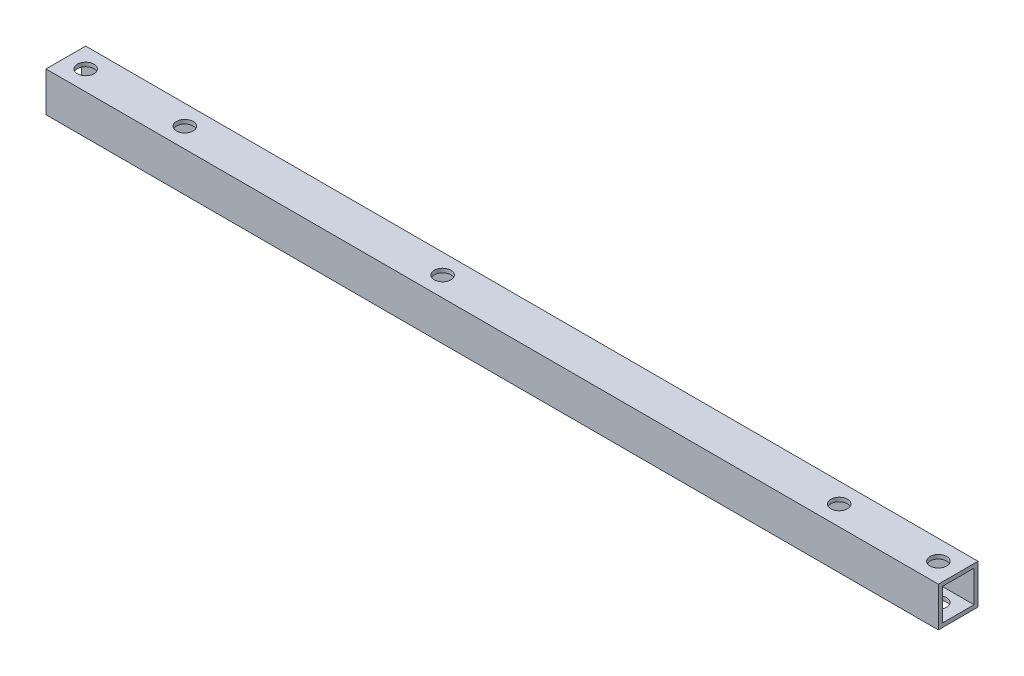
ISO-10303-21;
HEADER;
FILE_DESCRIPTION(('STEP AP214'),'2;1');
FILE_NAME('part.step','',(''),(''),'','','');
FILE_SCHEMA(('AUTOMOTIVE_DESIGN { 1 0 10303 214 1 1 1 1 }'));
ENDSEC;
DATA;
#1=APPLICATION_CONTEXT('core data for automotive mechanical design processes');
#2=APPLICATION_PROTOCOL_DEFINITION('international standard','automotive_design',2000,#1);
#3=PRODUCT_CONTEXT('',#1,'mechanical');
#4=PRODUCT('Part','Part','',(#3));
#5=PRODUCT_RELATED_PRODUCT_CATEGORY('part','',(#4));
#6=PRODUCT_DEFINITION_FORMATION('','',#4);
#7=PRODUCT_DEFINITION_CONTEXT('part definition',#1,'design');
#8=PRODUCT_DEFINITION('design','',#6,#7);
#9=PRODUCT_DEFINITION_SHAPE('','',#8);
#10=(LENGTH_UNIT() NAMED_UNIT(*) SI_UNIT(.MILLI.,.METRE.));
#11=(NAMED_UNIT(*) PLANE_ANGLE_UNIT() SI_UNIT($,.RADIAN.));
#12=(NAMED_UNIT(*) SI_UNIT($,.STERADIAN.) SOLID_ANGLE_UNIT());
#13=UNCERTAINTY_MEASURE_WITH_UNIT(LENGTH_MEASURE(1.E-05),#10,'distance_accuracy_value','');
#14=(GEOMETRIC_REPRESENTATION_CONTEXT(3) GLOBAL_UNCERTAINTY_ASSIGNED_CONTEXT((#13)) GLOBAL_UNIT_ASSIGNED_CONTEXT((#10,
#11,#12)) REPRESENTATION_CONTEXT('',''));
#15=CARTESIAN_POINT('',(0.,0.,0.));
#16=DIRECTION('',(0.,0.,1.));
#17=DIRECTION('',(1.,0.,0.));
#18=AXIS2_PLACEMENT_3D('',#15,#16,#17);
#19=CARTESIAN_POINT('',(225.,0.,0.));
#20=DIRECTION('',(1.,0.,0.));
#21=DIRECTION('',(0.,0.,-1.));
#22=AXIS2_PLACEMENT_3D('',#19,#20,#21);
#23=PLANE('',#22);
#24=DIRECTION('',(0.,1.,0.));
#25=VECTOR('',#24,1.);
#26=CARTESIAN_POINT('',(225.,5.,-5.));
#27=LINE('',#26,#25);
#28=CARTESIAN_POINT('',(225.,-5.,-5.));
#29=VERTEX_POINT('',#28);
#30=CARTESIAN_POINT('',(225.,5.,-5.));
#31=VERTEX_POINT('',#30);
#32=EDGE_CURVE('E164',#29,#31,#27,.T.);
#33=ORIENTED_EDGE('',*,*,#32,.T.);
#34=DIRECTION('',(0.,0.,1.));
#35=VECTOR('',#34,1.);
#36=CARTESIAN_POINT('',(225.,5.,5.));
#37=LINE('',#36,#35);
#38=CARTESIAN_POINT('',(225.,5.,5.));
#39=VERTEX_POINT('',#38);
#40=EDGE_CURVE('E167',#31,#39,#37,.T.);
#41=ORIENTED_EDGE('',*,*,#40,.T.);
#42=DIRECTION('',(0.,-1.,0.));
#43=VECTOR('',#42,1.);
#44=CARTESIAN_POINT('',(225.,5.,5.));
#45=LINE('',#44,#43);
#46=CARTESIAN_POINT('',(225.,-5.,5.));
#47=VERTEX_POINT('',#46);
#48=EDGE_CURVE('E170',#39,#47,#45,.T.);
#49=ORIENTED_EDGE('',*,*,#48,.T.);
#50=DIRECTION('',(0.,0.,-1.));
#51=VECTOR('',#50,1.);
#52=CARTESIAN_POINT('',(225.,-5.,5.));
#53=LINE('',#52,#51);
#54=EDGE_CURVE('E172',#47,#29,#53,.T.);
#55=ORIENTED_EDGE('',*,*,#54,.T.);
#56=EDGE_LOOP('',(#33,#41,#49,#55));
#57=FACE_BOUND('',#56,.T.);
#58=DIRECTION('',(0.,0.,1.));
#59=VECTOR('',#58,1.);
#60=CARTESIAN_POINT('',(225.,4.,5.));
#61=LINE('',#60,#59);
#62=CARTESIAN_POINT('',(225.,4.,-4.));
#63=VERTEX_POINT('',#62);
#64=CARTESIAN_POINT('',(225.,4.,4.));
#65=VERTEX_POINT('',#64);
#66=EDGE_CURVE('E134',#63,#65,#61,.T.);
#67=ORIENTED_EDGE('',*,*,#66,.F.);
#68=DIRECTION('',(0.,1.,0.));
#69=VECTOR('',#68,1.);
#70=CARTESIAN_POINT('',(225.,5.,-4.));
#71=LINE('',#70,#69);
#72=CARTESIAN_POINT('',(225.,-4.,-4.));
#73=VERTEX_POINT('',#72);
#74=EDGE_CURVE('E126',#73,#63,#71,.T.);
#75=ORIENTED_EDGE('',*,*,#74,.F.);
#76=DIRECTION('',(0.,0.,-1.));
#77=VECTOR('',#76,1.);
#78=CARTESIAN_POINT('',(225.,-4.,5.));
#79=LINE('',#78,#77);
#80=CARTESIAN_POINT('',(225.,-4.,4.));
#81=VERTEX_POINT('',#80);
#82=EDGE_CURVE('E148',#81,#73,#79,.T.);
#83=ORIENTED_EDGE('',*,*,#82,.F.);
#84=DIRECTION('',(0.,-1.,0.));
#85=VECTOR('',#84,1.);
#86=CARTESIAN_POINT('',(225.,5.,4.));
#87=LINE('',#86,#85);
#88=EDGE_CURVE('E146',#65,#81,#87,.T.);
#89=ORIENTED_EDGE('',*,*,#88,.F.);
#90=EDGE_LOOP('',(#67,#75,#83,#89));
#91=FACE_BOUND('',#90,.T.);
#92=ADVANCED_FACE('F59',(#57,#91),#23,.T.);
#93=CARTESIAN_POINT('',(0.,0.,0.));
#94=DIRECTION('',(1.,0.,0.));
#95=DIRECTION('',(0.,0.,-1.));
#96=AXIS2_PLACEMENT_3D('',#93,#94,#95);
#97=PLANE('',#96);
#98=DIRECTION('',(0.,1.,0.));
#99=VECTOR('',#98,1.);
#100=CARTESIAN_POINT('',(0.,5.,-5.));
#101=LINE('',#100,#99);
#102=CARTESIAN_POINT('',(0.,-5.,-5.));
#103=VERTEX_POINT('',#102);
#104=CARTESIAN_POINT('',(0.,5.,-5.));
#105=VERTEX_POINT('',#104);
#106=EDGE_CURVE('E142',#103,#105,#101,.T.);
#107=ORIENTED_EDGE('',*,*,#106,.F.);
#108=DIRECTION('',(0.,0.,-1.));
#109=VECTOR('',#108,1.);
#110=CARTESIAN_POINT('',(0.,-5.,5.));
#111=LINE('',#110,#109);
#112=CARTESIAN_POINT('',(0.,-5.,5.));
#113=VERTEX_POINT('',#112);
#114=EDGE_CURVE('E168',#113,#103,#111,.T.);
#115=ORIENTED_EDGE('',*,*,#114,.F.);
#116=DIRECTION('',(0.,-1.,0.));
#117=VECTOR('',#116,1.);
#118=CARTESIAN_POINT('',(0.,5.,5.));
#119=LINE('',#118,#117);
#120=CARTESIAN_POINT('',(0.,5.,5.));
#121=VERTEX_POINT('',#120);
#122=EDGE_CURVE('E179',#121,#113,#119,.T.);
#123=ORIENTED_EDGE('',*,*,#122,.F.);
#124=DIRECTION('',(0.,0.,1.));
#125=VECTOR('',#124,1.);
#126=CARTESIAN_POINT('',(0.,5.,5.));
#127=LINE('',#126,#125);
#128=EDGE_CURVE('E177',#105,#121,#127,.T.);
#129=ORIENTED_EDGE('',*,*,#128,.F.);
#130=EDGE_LOOP('',(#107,#115,#123,#129));
#131=FACE_BOUND('',#130,.T.);
#132=DIRECTION('',(0.,1.,0.));
#133=VECTOR('',#132,1.);
#134=CARTESIAN_POINT('',(0.,5.,-4.));
#135=LINE('',#134,#133);
#136=CARTESIAN_POINT('',(0.,-4.,-4.));
#137=VERTEX_POINT('',#136);
#138=CARTESIAN_POINT('',(0.,4.,-4.));
#139=VERTEX_POINT('',#138);
#140=EDGE_CURVE('E84',#137,#139,#135,.T.);
#141=ORIENTED_EDGE('',*,*,#140,.T.);
#142=DIRECTION('',(0.,0.,1.));
#143=VECTOR('',#142,1.);
#144=CARTESIAN_POINT('',(0.,4.,5.));
#145=LINE('',#144,#143);
#146=CARTESIAN_POINT('',(0.,4.,4.));
#147=VERTEX_POINT('',#146);
#148=EDGE_CURVE('E141',#139,#147,#145,.T.);
#149=ORIENTED_EDGE('',*,*,#148,.T.);
#150=DIRECTION('',(0.,-1.,0.));
#151=VECTOR('',#150,1.);
#152=CARTESIAN_POINT('',(0.,5.,4.));
#153=LINE('',#152,#151);
#154=CARTESIAN_POINT('',(0.,-4.,4.));
#155=VERTEX_POINT('',#154);
#156=EDGE_CURVE('E156',#147,#155,#153,.T.);
#157=ORIENTED_EDGE('',*,*,#156,.T.);
#158=DIRECTION('',(0.,0.,-1.));
#159=VECTOR('',#158,1.);
#160=CARTESIAN_POINT('',(0.,-4.,5.));
#161=LINE('',#160,#159);
#162=EDGE_CURVE('E135',#155,#137,#161,.T.);
#163=ORIENTED_EDGE('',*,*,#162,.T.);
#164=EDGE_LOOP('',(#141,#149,#157,#163));
#165=FACE_BOUND('',#164,.T.);
#166=ADVANCED_FACE('F268',(#131,#165),#97,.F.);
#167=CARTESIAN_POINT('',(225.,5.,-5.));
#168=DIRECTION('',(0.,0.,1.));
#169=DIRECTION('',(0.,-1.,0.));
#170=AXIS2_PLACEMENT_3D('',#167,#168,#169);
#171=PLANE('',#170);
#172=ORIENTED_EDGE('',*,*,#106,.T.);
#173=DIRECTION('',(-1.,0.,0.));
#174=VECTOR('',#173,1.);
#175=CARTESIAN_POINT('',(225.,5.,-5.));
#176=LINE('',#175,#174);
#177=EDGE_CURVE('E12',#31,#105,#176,.T.);
#178=ORIENTED_EDGE('',*,*,#177,.F.);
#179=ORIENTED_EDGE('',*,*,#32,.F.);
#180=DIRECTION('',(-1.,0.,0.));
#181=VECTOR('',#180,1.);
#182=CARTESIAN_POINT('',(225.,-5.,-5.));
#183=LINE('',#182,#181);
#184=EDGE_CURVE('E174',#29,#103,#183,.T.);
#185=ORIENTED_EDGE('',*,*,#184,.T.);
#186=EDGE_LOOP('',(#172,#178,#179,#185));
#187=FACE_BOUND('',#186,.T.);
#188=ADVANCED_FACE('F61',(#187),#171,.F.);
#189=CARTESIAN_POINT('',(225.,5.,5.));
#190=DIRECTION('',(0.,-1.,0.));
#191=DIRECTION('',(0.,0.,-1.));
#192=AXIS2_PLACEMENT_3D('',#189,#190,#191);
#193=PLANE('',#192);
#194=CARTESIAN_POINT('',(95.,5.,0.));
#195=DIRECTION('',(0.,1.,0.));
#196=DIRECTION('',(0.,0.,1.));
#197=AXIS2_PLACEMENT_3D('',#194,#195,#196);
#198=CIRCLE('',#197,2.1);
#199=CARTESIAN_POINT('',(95.,5.,2.1));
#200=VERTEX_POINT('',#199);
#201=EDGE_CURVE('E241',#200,#200,#198,.T.);
#202=ORIENTED_EDGE('',*,*,#201,.F.);
#203=EDGE_LOOP('',(#202));
#204=FACE_BOUND('',#203,.T.);
#205=CARTESIAN_POINT('',(220.,5.,0.));
#206=DIRECTION('',(0.,1.,0.));
#207=DIRECTION('',(0.,0.,1.));
#208=AXIS2_PLACEMENT_3D('',#205,#206,#207);
#209=CIRCLE('',#208,2.10000000000002);
#210=CARTESIAN_POINT('',(220.,5.,2.10000000000002));
#211=VERTEX_POINT('',#210);
#212=EDGE_CURVE('E228',#211,#211,#209,.T.);
#213=ORIENTED_EDGE('',*,*,#212,.F.);
#214=EDGE_LOOP('',(#213));
#215=FACE_BOUND('',#214,.T.);
#216=CARTESIAN_POINT('',(5.,5.,0.));
#217=DIRECTION('',(0.,1.,0.));
#218=DIRECTION('',(0.,0.,-1.));
#219=AXIS2_PLACEMENT_3D('',#216,#217,#218);
#220=CIRCLE('',#219,2.10000000000002);
#221=CARTESIAN_POINT('',(5.,5.,-2.10000000000002));
#222=VERTEX_POINT('',#221);
#223=EDGE_CURVE('E221',#222,#222,#220,.T.);
#224=ORIENTED_EDGE('',*,*,#223,.F.);
#225=EDGE_LOOP('',(#224));
#226=FACE_BOUND('',#225,.T.);
#227=CARTESIAN_POINT('',(30.,5.,0.));
#228=DIRECTION('',(0.,1.,0.));
#229=DIRECTION('',(0.,0.,-1.));
#230=AXIS2_PLACEMENT_3D('',#227,#228,#229);
#231=CIRCLE('',#230,2.1);
#232=CARTESIAN_POINT('',(30.,5.,-2.10000000000001));
#233=VERTEX_POINT('',#232);
#234=EDGE_CURVE('E233',#233,#233,#231,.T.);
#235=ORIENTED_EDGE('',*,*,#234,.F.);
#236=EDGE_LOOP('',(#235));
#237=FACE_BOUND('',#236,.T.);
#238=CARTESIAN_POINT('',(195.,5.,0.));
#239=DIRECTION('',(0.,1.,0.));
#240=DIRECTION('',(0.,0.,1.));
#241=AXIS2_PLACEMENT_3D('',#238,#239,#240);
#242=CIRCLE('',#241,2.10000000000002);
#243=CARTESIAN_POINT('',(195.,5.,2.10000000000003));
#244=VERTEX_POINT('',#243);
#245=EDGE_CURVE('E215',#244,#244,#242,.T.);
#246=ORIENTED_EDGE('',*,*,#245,.F.);
#247=EDGE_LOOP('',(#246));
#248=FACE_BOUND('',#247,.T.);
#249=ORIENTED_EDGE('',*,*,#128,.T.);
#250=DIRECTION('',(-1.,0.,0.));
#251=VECTOR('',#250,1.);
#252=CARTESIAN_POINT('',(225.,5.,5.));
#253=LINE('',#252,#251);
#254=EDGE_CURVE('E68',#39,#121,#253,.T.);
#255=ORIENTED_EDGE('',*,*,#254,.F.);
#256=ORIENTED_EDGE('',*,*,#40,.F.);
#257=ORIENTED_EDGE('',*,*,#177,.T.);
#258=EDGE_LOOP('',(#249,#255,#256,#257));
#259=FACE_BOUND('',#258,.T.);
#260=ADVANCED_FACE('F292',(#204,#215,#226,#237,#248,#259),#193,.F.);
#261=CARTESIAN_POINT('',(225.,5.,5.));
#262=DIRECTION('',(0.,0.,-1.));
#263=DIRECTION('',(0.,1.,0.));
#264=AXIS2_PLACEMENT_3D('',#261,#262,#263);
#265=PLANE('',#264);
#266=ORIENTED_EDGE('',*,*,#122,.T.);
#267=DIRECTION('',(-1.,0.,0.));
#268=VECTOR('',#267,1.);
#269=CARTESIAN_POINT('',(225.,-5.,5.));
#270=LINE('',#269,#268);
#271=EDGE_CURVE('E184',#47,#113,#270,.T.);
#272=ORIENTED_EDGE('',*,*,#271,.F.);
#273=ORIENTED_EDGE('',*,*,#48,.F.);
#274=ORIENTED_EDGE('',*,*,#254,.T.);
#275=EDGE_LOOP('',(#266,#272,#273,#274));
#276=FACE_BOUND('',#275,.T.);
#277=ADVANCED_FACE('F290',(#276),#265,.F.);
#278=CARTESIAN_POINT('',(225.,-5.,5.));
#279=DIRECTION('',(0.,1.,0.));
#280=DIRECTION('',(0.,0.,1.));
#281=AXIS2_PLACEMENT_3D('',#278,#279,#280);
#282=PLANE('',#281);
#283=CARTESIAN_POINT('',(95.,-5.,0.));
#284=DIRECTION('',(0.,1.,0.));
#285=DIRECTION('',(0.,0.,1.));
#286=AXIS2_PLACEMENT_3D('',#283,#284,#285);
#287=CIRCLE('',#286,2.1);
#288=CARTESIAN_POINT('',(95.,-5.,2.1));
#289=VERTEX_POINT('',#288);
#290=EDGE_CURVE('E244',#289,#289,#287,.T.);
#291=ORIENTED_EDGE('',*,*,#290,.T.);
#292=EDGE_LOOP('',(#291));
#293=FACE_BOUND('',#292,.T.);
#294=CARTESIAN_POINT('',(220.,-5.,0.));
#295=DIRECTION('',(0.,1.,0.));
#296=DIRECTION('',(0.,0.,1.));
#297=AXIS2_PLACEMENT_3D('',#294,#295,#296);
#298=CIRCLE('',#297,2.10000000000002);
#299=CARTESIAN_POINT('',(220.,-5.,2.10000000000002));
#300=VERTEX_POINT('',#299);
#301=EDGE_CURVE('E218',#300,#300,#298,.T.);
#302=ORIENTED_EDGE('',*,*,#301,.T.);
#303=EDGE_LOOP('',(#302));
#304=FACE_BOUND('',#303,.T.);
#305=CARTESIAN_POINT('',(5.,-5.,0.));
#306=DIRECTION('',(0.,1.,0.));
#307=DIRECTION('',(0.,0.,-1.));
#308=AXIS2_PLACEMENT_3D('',#305,#306,#307);
#309=CIRCLE('',#308,2.10000000000002);
#310=CARTESIAN_POINT('',(5.,-5.,-2.10000000000002));
#311=VERTEX_POINT('',#310);
#312=EDGE_CURVE('E224',#311,#311,#309,.T.);
#313=ORIENTED_EDGE('',*,*,#312,.T.);
#314=EDGE_LOOP('',(#313));
#315=FACE_BOUND('',#314,.T.);
#316=CARTESIAN_POINT('',(30.,-5.,0.));
#317=DIRECTION('',(0.,1.,0.));
#318=DIRECTION('',(0.,0.,-1.));
#319=AXIS2_PLACEMENT_3D('',#316,#317,#318);
#320=CIRCLE('',#319,2.1);
#321=CARTESIAN_POINT('',(30.,-5.,-2.10000000000001));
#322=VERTEX_POINT('',#321);
#323=EDGE_CURVE('E225',#322,#322,#320,.T.);
#324=ORIENTED_EDGE('',*,*,#323,.T.);
#325=EDGE_LOOP('',(#324));
#326=FACE_BOUND('',#325,.T.);
#327=CARTESIAN_POINT('',(195.,-5.,0.));
#328=DIRECTION('',(0.,1.,0.));
#329=DIRECTION('',(0.,0.,1.));
#330=AXIS2_PLACEMENT_3D('',#327,#328,#329);
#331=CIRCLE('',#330,2.10000000000002);
#332=CARTESIAN_POINT('',(195.,-5.,2.10000000000003));
#333=VERTEX_POINT('',#332);
#334=EDGE_CURVE('E193',#333,#333,#331,.T.);
#335=ORIENTED_EDGE('',*,*,#334,.T.);
#336=EDGE_LOOP('',(#335));
#337=FACE_BOUND('',#336,.T.);
#338=ORIENTED_EDGE('',*,*,#114,.T.);
#339=ORIENTED_EDGE('',*,*,#184,.F.);
#340=ORIENTED_EDGE('',*,*,#54,.F.);
#341=ORIENTED_EDGE('',*,*,#271,.T.);
#342=EDGE_LOOP('',(#338,#339,#340,#341));
#343=FACE_BOUND('',#342,.T.);
#344=ADVANCED_FACE('F287',(#293,#304,#315,#326,#337,#343),#282,.F.);
#345=CARTESIAN_POINT('',(225.,5.,-4.));
#346=DIRECTION('',(0.,0.,1.));
#347=DIRECTION('',(0.,-1.,0.));
#348=AXIS2_PLACEMENT_3D('',#345,#346,#347);
#349=PLANE('',#348);
#350=ORIENTED_EDGE('',*,*,#140,.F.);
#351=DIRECTION('',(-1.,0.,0.));
#352=VECTOR('',#351,1.);
#353=CARTESIAN_POINT('',(225.,-4.,-4.));
#354=LINE('',#353,#352);
#355=EDGE_CURVE('E130',#73,#137,#354,.T.);
#356=ORIENTED_EDGE('',*,*,#355,.F.);
#357=ORIENTED_EDGE('',*,*,#74,.T.);
#358=DIRECTION('',(-1.,0.,0.));
#359=VECTOR('',#358,1.);
#360=CARTESIAN_POINT('',(225.,4.,-4.));
#361=LINE('',#360,#359);
#362=EDGE_CURVE('E129',#63,#139,#361,.T.);
#363=ORIENTED_EDGE('',*,*,#362,.T.);
#364=EDGE_LOOP('',(#350,#356,#357,#363));
#365=FACE_BOUND('',#364,.T.);
#366=ADVANCED_FACE('F128',(#365),#349,.T.);
#367=CARTESIAN_POINT('',(225.,4.,5.));
#368=DIRECTION('',(0.,-1.,0.));
#369=DIRECTION('',(0.,0.,-1.));
#370=AXIS2_PLACEMENT_3D('',#367,#368,#369);
#371=PLANE('',#370);
#372=CARTESIAN_POINT('',(95.,4.,0.));
#373=DIRECTION('',(0.,-1.,0.));
#374=DIRECTION('',(0.,0.,-1.));
#375=AXIS2_PLACEMENT_3D('',#372,#373,#374);
#376=CIRCLE('',#375,2.1);
#377=CARTESIAN_POINT('',(95.,4.,-2.1));
#378=VERTEX_POINT('',#377);
#379=EDGE_CURVE('E236',#378,#378,#376,.T.);
#380=ORIENTED_EDGE('',*,*,#379,.F.);
#381=EDGE_LOOP('',(#380));
#382=FACE_BOUND('',#381,.T.);
#383=CARTESIAN_POINT('',(220.,4.,0.));
#384=DIRECTION('',(0.,-1.,0.));
#385=DIRECTION('',(0.,0.,-1.));
#386=AXIS2_PLACEMENT_3D('',#383,#384,#385);
#387=CIRCLE('',#386,2.10000000000002);
#388=CARTESIAN_POINT('',(220.,4.,-2.10000000000002));
#389=VERTEX_POINT('',#388);
#390=EDGE_CURVE('E154',#389,#389,#387,.T.);
#391=ORIENTED_EDGE('',*,*,#390,.F.);
#392=EDGE_LOOP('',(#391));
#393=FACE_BOUND('',#392,.T.);
#394=CARTESIAN_POINT('',(5.,4.,0.));
#395=DIRECTION('',(0.,-1.,0.));
#396=DIRECTION('',(0.,0.,-1.));
#397=AXIS2_PLACEMENT_3D('',#394,#395,#396);
#398=CIRCLE('',#397,2.10000000000002);
#399=CARTESIAN_POINT('',(5.,4.,-2.10000000000002));
#400=VERTEX_POINT('',#399);
#401=EDGE_CURVE('E200',#400,#400,#398,.T.);
#402=ORIENTED_EDGE('',*,*,#401,.F.);
#403=EDGE_LOOP('',(#402));
#404=FACE_BOUND('',#403,.T.);
#405=CARTESIAN_POINT('',(30.,4.,0.));
#406=DIRECTION('',(0.,-1.,0.));
#407=DIRECTION('',(0.,0.,-1.));
#408=AXIS2_PLACEMENT_3D('',#405,#406,#407);
#409=CIRCLE('',#408,2.1);
#410=CARTESIAN_POINT('',(30.,4.,-2.10000000000001));
#411=VERTEX_POINT('',#410);
#412=EDGE_CURVE('E197',#411,#411,#409,.T.);
#413=ORIENTED_EDGE('',*,*,#412,.F.);
#414=EDGE_LOOP('',(#413));
#415=FACE_BOUND('',#414,.T.);
#416=CARTESIAN_POINT('',(195.,4.,0.));
#417=DIRECTION('',(0.,-1.,0.));
#418=DIRECTION('',(0.,0.,-1.));
#419=AXIS2_PLACEMENT_3D('',#416,#417,#418);
#420=CIRCLE('',#419,2.10000000000002);
#421=CARTESIAN_POINT('',(195.,4.,-2.10000000000001));
#422=VERTEX_POINT('',#421);
#423=EDGE_CURVE('E192',#422,#422,#420,.T.);
#424=ORIENTED_EDGE('',*,*,#423,.F.);
#425=EDGE_LOOP('',(#424));
#426=FACE_BOUND('',#425,.T.);
#427=ORIENTED_EDGE('',*,*,#148,.F.);
#428=ORIENTED_EDGE('',*,*,#362,.F.);
#429=ORIENTED_EDGE('',*,*,#66,.T.);
#430=DIRECTION('',(-1.,0.,0.));
#431=VECTOR('',#430,1.);
#432=CARTESIAN_POINT('',(225.,4.,4.));
#433=LINE('',#432,#431);
#434=EDGE_CURVE('E143',#65,#147,#433,.T.);
#435=ORIENTED_EDGE('',*,*,#434,.T.);
#436=EDGE_LOOP('',(#427,#428,#429,#435));
#437=FACE_BOUND('',#436,.T.);
#438=ADVANCED_FACE('F138',(#382,#393,#404,#415,#426,#437),#371,.T.);
#439=CARTESIAN_POINT('',(225.,5.,4.));
#440=DIRECTION('',(0.,0.,-1.));
#441=DIRECTION('',(0.,1.,0.));
#442=AXIS2_PLACEMENT_3D('',#439,#440,#441);
#443=PLANE('',#442);
#444=ORIENTED_EDGE('',*,*,#156,.F.);
#445=ORIENTED_EDGE('',*,*,#434,.F.);
#446=ORIENTED_EDGE('',*,*,#88,.T.);
#447=DIRECTION('',(-1.,0.,0.));
#448=VECTOR('',#447,1.);
#449=CARTESIAN_POINT('',(225.,-4.,4.));
#450=LINE('',#449,#448);
#451=EDGE_CURVE('E76',#81,#155,#450,.T.);
#452=ORIENTED_EDGE('',*,*,#451,.T.);
#453=EDGE_LOOP('',(#444,#445,#446,#452));
#454=FACE_BOUND('',#453,.T.);
#455=ADVANCED_FACE('F258',(#454),#443,.T.);
#456=CARTESIAN_POINT('',(225.,-4.,5.));
#457=DIRECTION('',(0.,1.,0.));
#458=DIRECTION('',(0.,0.,1.));
#459=AXIS2_PLACEMENT_3D('',#456,#457,#458);
#460=PLANE('',#459);
#461=CARTESIAN_POINT('',(95.,-4.,0.));
#462=DIRECTION('',(0.,1.,0.));
#463=DIRECTION('',(0.,0.,1.));
#464=AXIS2_PLACEMENT_3D('',#461,#462,#463);
#465=CIRCLE('',#464,2.1);
#466=CARTESIAN_POINT('',(95.,-4.,2.1));
#467=VERTEX_POINT('',#466);
#468=EDGE_CURVE('E63',#467,#467,#465,.T.);
#469=ORIENTED_EDGE('',*,*,#468,.F.);
#470=EDGE_LOOP('',(#469));
#471=FACE_BOUND('',#470,.T.);
#472=CARTESIAN_POINT('',(220.,-4.,0.));
#473=DIRECTION('',(0.,1.,0.));
#474=DIRECTION('',(0.,0.,1.));
#475=AXIS2_PLACEMENT_3D('',#472,#473,#474);
#476=CIRCLE('',#475,2.10000000000002);
#477=CARTESIAN_POINT('',(220.,-4.,2.10000000000002));
#478=VERTEX_POINT('',#477);
#479=EDGE_CURVE('E201',#478,#478,#476,.T.);
#480=ORIENTED_EDGE('',*,*,#479,.F.);
#481=EDGE_LOOP('',(#480));
#482=FACE_BOUND('',#481,.T.);
#483=CARTESIAN_POINT('',(5.,-4.,0.));
#484=DIRECTION('',(0.,1.,0.));
#485=DIRECTION('',(0.,0.,1.));
#486=AXIS2_PLACEMENT_3D('',#483,#484,#485);
#487=CIRCLE('',#486,2.10000000000002);
#488=CARTESIAN_POINT('',(5.,-4.,2.10000000000001));
#489=VERTEX_POINT('',#488);
#490=EDGE_CURVE('E198',#489,#489,#487,.T.);
#491=ORIENTED_EDGE('',*,*,#490,.F.);
#492=EDGE_LOOP('',(#491));
#493=FACE_BOUND('',#492,.T.);
#494=CARTESIAN_POINT('',(30.,-4.,0.));
#495=DIRECTION('',(0.,1.,0.));
#496=DIRECTION('',(0.,0.,1.));
#497=AXIS2_PLACEMENT_3D('',#494,#495,#496);
#498=CIRCLE('',#497,2.1);
#499=CARTESIAN_POINT('',(30.,-4.,2.1));
#500=VERTEX_POINT('',#499);
#501=EDGE_CURVE('E194',#500,#500,#498,.T.);
#502=ORIENTED_EDGE('',*,*,#501,.F.);
#503=EDGE_LOOP('',(#502));
#504=FACE_BOUND('',#503,.T.);
#505=CARTESIAN_POINT('',(195.,-4.,0.));
#506=DIRECTION('',(0.,1.,0.));
#507=DIRECTION('',(0.,0.,1.));
#508=AXIS2_PLACEMENT_3D('',#505,#506,#507);
#509=CIRCLE('',#508,2.10000000000002);
#510=CARTESIAN_POINT('',(195.,-4.,2.10000000000003));
#511=VERTEX_POINT('',#510);
#512=EDGE_CURVE('E189',#511,#511,#509,.T.);
#513=ORIENTED_EDGE('',*,*,#512,.F.);
#514=EDGE_LOOP('',(#513));
#515=FACE_BOUND('',#514,.T.);
#516=ORIENTED_EDGE('',*,*,#162,.F.);
#517=ORIENTED_EDGE('',*,*,#451,.F.);
#518=ORIENTED_EDGE('',*,*,#82,.T.);
#519=ORIENTED_EDGE('',*,*,#355,.T.);
#520=EDGE_LOOP('',(#516,#517,#518,#519));
#521=FACE_BOUND('',#520,.T.);
#522=ADVANCED_FACE('F254',(#471,#482,#493,#504,#515,#521),#460,.T.);
#523=CARTESIAN_POINT('',(195.,-5.,0.));
#524=DIRECTION('',(0.,1.,0.));
#525=DIRECTION('',(0.,0.,1.));
#526=AXIS2_PLACEMENT_3D('',#523,#524,#525);
#527=CYLINDRICAL_SURFACE('',#526,2.10000000000002);
#528=ORIENTED_EDGE('',*,*,#512,.T.);
#529=EDGE_LOOP('',(#528));
#530=FACE_BOUND('',#529,.T.);
#531=ORIENTED_EDGE('',*,*,#334,.F.);
#532=EDGE_LOOP('',(#531));
#533=FACE_BOUND('',#532,.T.);
#534=ADVANCED_FACE('F257',(#530,#533),#527,.F.);
#535=CARTESIAN_POINT('',(30.,-5.,0.));
#536=DIRECTION('',(0.,1.,0.));
#537=DIRECTION('',(0.,0.,1.));
#538=AXIS2_PLACEMENT_3D('',#535,#536,#537);
#539=CYLINDRICAL_SURFACE('',#538,2.1);
#540=ORIENTED_EDGE('',*,*,#501,.T.);
#541=EDGE_LOOP('',(#540));
#542=FACE_BOUND('',#541,.T.);
#543=ORIENTED_EDGE('',*,*,#323,.F.);
#544=EDGE_LOOP('',(#543));
#545=FACE_BOUND('',#544,.T.);
#546=ADVANCED_FACE('F335',(#542,#545),#539,.F.);
#547=CARTESIAN_POINT('',(5.,-5.,0.));
#548=DIRECTION('',(0.,1.,0.));
#549=DIRECTION('',(0.,0.,1.));
#550=AXIS2_PLACEMENT_3D('',#547,#548,#549);
#551=CYLINDRICAL_SURFACE('',#550,2.10000000000002);
#552=ORIENTED_EDGE('',*,*,#490,.T.);
#553=EDGE_LOOP('',(#552));
#554=FACE_BOUND('',#553,.T.);
#555=ORIENTED_EDGE('',*,*,#312,.F.);
#556=EDGE_LOOP('',(#555));
#557=FACE_BOUND('',#556,.T.);
#558=ADVANCED_FACE('F336',(#554,#557),#551,.F.);
#559=CARTESIAN_POINT('',(220.,-5.,0.));
#560=DIRECTION('',(0.,1.,0.));
#561=DIRECTION('',(0.,0.,1.));
#562=AXIS2_PLACEMENT_3D('',#559,#560,#561);
#563=CYLINDRICAL_SURFACE('',#562,2.10000000000002);
#564=ORIENTED_EDGE('',*,*,#479,.T.);
#565=EDGE_LOOP('',(#564));
#566=FACE_BOUND('',#565,.T.);
#567=ORIENTED_EDGE('',*,*,#301,.F.);
#568=EDGE_LOOP('',(#567));
#569=FACE_BOUND('',#568,.T.);
#570=ADVANCED_FACE('F325',(#566,#569),#563,.F.);
#571=ORIENTED_EDGE('',*,*,#423,.T.);
#572=EDGE_LOOP('',(#571));
#573=FACE_BOUND('',#572,.T.);
#574=ORIENTED_EDGE('',*,*,#245,.T.);
#575=EDGE_LOOP('',(#574));
#576=FACE_BOUND('',#575,.T.);
#577=ADVANCED_FACE('F322',(#573,#576),#527,.F.);
#578=ORIENTED_EDGE('',*,*,#412,.T.);
#579=EDGE_LOOP('',(#578));
#580=FACE_BOUND('',#579,.T.);
#581=ORIENTED_EDGE('',*,*,#234,.T.);
#582=EDGE_LOOP('',(#581));
#583=FACE_BOUND('',#582,.T.);
#584=ADVANCED_FACE('F324',(#580,#583),#539,.F.);
#585=ORIENTED_EDGE('',*,*,#401,.T.);
#586=EDGE_LOOP('',(#585));
#587=FACE_BOUND('',#586,.T.);
#588=ORIENTED_EDGE('',*,*,#223,.T.);
#589=EDGE_LOOP('',(#588));
#590=FACE_BOUND('',#589,.T.);
#591=ADVANCED_FACE('F332',(#587,#590),#551,.F.);
#592=ORIENTED_EDGE('',*,*,#390,.T.);
#593=EDGE_LOOP('',(#592));
#594=FACE_BOUND('',#593,.T.);
#595=ORIENTED_EDGE('',*,*,#212,.T.);
#596=EDGE_LOOP('',(#595));
#597=FACE_BOUND('',#596,.T.);
#598=ADVANCED_FACE('F338',(#594,#597),#563,.F.);
#599=CARTESIAN_POINT('',(95.,-5.,0.));
#600=DIRECTION('',(0.,1.,0.));
#601=DIRECTION('',(0.,0.,1.));
#602=AXIS2_PLACEMENT_3D('',#599,#600,#601);
#603=CYLINDRICAL_SURFACE('',#602,2.1);
#604=ORIENTED_EDGE('',*,*,#468,.T.);
#605=EDGE_LOOP('',(#604));
#606=FACE_BOUND('',#605,.T.);
#607=ORIENTED_EDGE('',*,*,#290,.F.);
#608=EDGE_LOOP('',(#607));
#609=FACE_BOUND('',#608,.T.);
#610=ADVANCED_FACE('F251',(#606,#609),#603,.F.);
#611=ORIENTED_EDGE('',*,*,#379,.T.);
#612=EDGE_LOOP('',(#611));
#613=FACE_BOUND('',#612,.T.);
#614=ORIENTED_EDGE('',*,*,#201,.T.);
#615=EDGE_LOOP('',(#614));
#616=FACE_BOUND('',#615,.T.);
#617=ADVANCED_FACE('F356',(#613,#616),#603,.F.);
#618=CLOSED_SHELL('',(#92,#166,#188,#260,#277,#344,#366,#438,#455,#522,#534,#546,#558,#570,#577,
#584,#591,#598,#610,#617));
#619=MANIFOLD_SOLID_BREP('B2',#618);
#620=ADVANCED_BREP_SHAPE_REPRESENTATION('',(#18,#619),#14);
#621=SHAPE_DEFINITION_REPRESENTATION(#9,#620);
ENDSEC;
END-ISO-10303-21;
